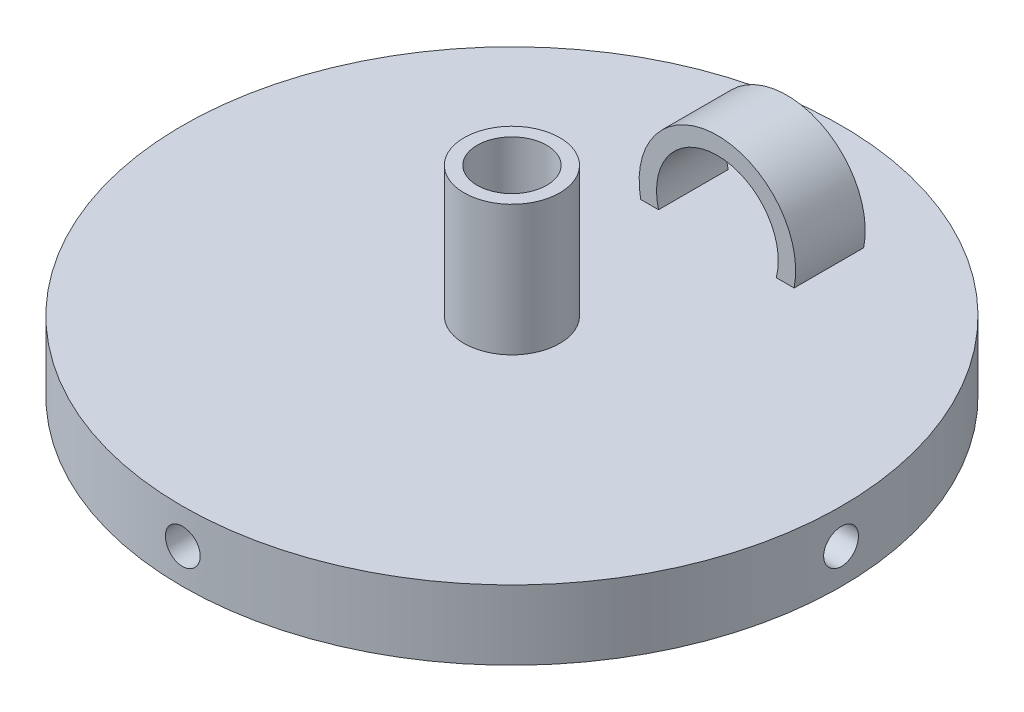
ISO-10303-21;
HEADER;
FILE_DESCRIPTION(('STEP AP214'),'2;1');
FILE_NAME('part.step','',(''),(''),'','','');
FILE_SCHEMA(('AUTOMOTIVE_DESIGN { 1 0 10303 214 1 1 1 1 }'));
ENDSEC;
DATA;
#1=APPLICATION_CONTEXT('core data for automotive mechanical design processes');
#2=APPLICATION_PROTOCOL_DEFINITION('international standard','automotive_design',2000,#1);
#3=PRODUCT_CONTEXT('',#1,'mechanical');
#4=PRODUCT('Part','Part','',(#3));
#5=PRODUCT_RELATED_PRODUCT_CATEGORY('part','',(#4));
#6=PRODUCT_DEFINITION_FORMATION('','',#4);
#7=PRODUCT_DEFINITION_CONTEXT('part definition',#1,'design');
#8=PRODUCT_DEFINITION('design','',#6,#7);
#9=PRODUCT_DEFINITION_SHAPE('','',#8);
#10=(LENGTH_UNIT() NAMED_UNIT(*) SI_UNIT(.MILLI.,.METRE.));
#11=(NAMED_UNIT(*) PLANE_ANGLE_UNIT() SI_UNIT($,.RADIAN.));
#12=(NAMED_UNIT(*) SI_UNIT($,.STERADIAN.) SOLID_ANGLE_UNIT());
#13=UNCERTAINTY_MEASURE_WITH_UNIT(LENGTH_MEASURE(1.E-05),#10,'distance_accuracy_value','');
#14=(GEOMETRIC_REPRESENTATION_CONTEXT(3) GLOBAL_UNCERTAINTY_ASSIGNED_CONTEXT((#13)) GLOBAL_UNIT_ASSIGNED_CONTEXT((#10,
#11,#12)) REPRESENTATION_CONTEXT('',''));
#15=CARTESIAN_POINT('',(0.,0.,0.));
#16=DIRECTION('',(0.,0.,1.));
#17=DIRECTION('',(1.,0.,0.));
#18=AXIS2_PLACEMENT_3D('',#15,#16,#17);
#19=CARTESIAN_POINT('',(0.,8.,-19.));
#20=DIRECTION('',(0.,1.,0.));
#21=DIRECTION('',(-1.,0.,0.));
#22=AXIS2_PLACEMENT_3D('',#19,#20,#21);
#23=PLANE('',#22);
#24=DIRECTION('',(1.,0.,0.));
#25=VECTOR('',#24,1.);
#26=CARTESIAN_POINT('',(0.,8.,-27.));
#27=LINE('',#26,#25);
#28=CARTESIAN_POINT('',(11.3945238196925,8.,-27.));
#29=VERTEX_POINT('',#28);
#30=CARTESIAN_POINT('',(13.4475922365198,8.,-27.));
#31=VERTEX_POINT('',#30);
#32=EDGE_CURVE('E134',#29,#31,#27,.T.);
#33=ORIENTED_EDGE('',*,*,#32,.T.);
#34=DIRECTION('',(0.,0.,-1.));
#35=VECTOR('',#34,1.);
#36=CARTESIAN_POINT('',(13.4475922365198,8.,-19.));
#37=LINE('',#36,#35);
#38=CARTESIAN_POINT('',(13.4475922365198,8.,-19.));
#39=VERTEX_POINT('',#38);
#40=EDGE_CURVE('E12',#39,#31,#37,.T.);
#41=ORIENTED_EDGE('',*,*,#40,.F.);
#42=DIRECTION('',(1.,0.,0.));
#43=VECTOR('',#42,1.);
#44=CARTESIAN_POINT('',(0.,8.,-19.));
#45=LINE('',#44,#43);
#46=CARTESIAN_POINT('',(11.3945238196925,8.,-19.));
#47=VERTEX_POINT('',#46);
#48=EDGE_CURVE('E109',#47,#39,#45,.T.);
#49=ORIENTED_EDGE('',*,*,#48,.F.);
#50=DIRECTION('',(0.,0.,-1.));
#51=VECTOR('',#50,1.);
#52=CARTESIAN_POINT('',(11.3945238196925,8.,-19.));
#53=LINE('',#52,#51);
#54=EDGE_CURVE('E76',#47,#29,#53,.T.);
#55=ORIENTED_EDGE('',*,*,#54,.T.);
#56=EDGE_LOOP('',(#33,#41,#49,#55));
#57=FACE_BOUND('',#56,.T.);
#58=ADVANCED_FACE('F58',(#57),#23,.F.);
#59=CARTESIAN_POINT('',(4.62784477283367,9.79222059936862,-19.));
#60=DIRECTION('',(0.,0.,-1.));
#61=DIRECTION('',(-1.,0.,0.));
#62=AXIS2_PLACEMENT_3D('',#59,#60,#61);
#63=CYLINDRICAL_SURFACE('',#62,9.);
#64=CARTESIAN_POINT('',(4.62784477283367,9.79222059936862,-27.));
#65=DIRECTION('',(0.,0.,1.));
#66=DIRECTION('',(1.,0.,0.));
#67=AXIS2_PLACEMENT_3D('',#64,#65,#66);
#68=CIRCLE('',#67,9.);
#69=CARTESIAN_POINT('',(-4.19190269085251,8.,-27.));
#70=VERTEX_POINT('',#69);
#71=EDGE_CURVE('E114',#31,#70,#68,.T.);
#72=ORIENTED_EDGE('',*,*,#71,.T.);
#73=DIRECTION('',(0.,0.,-1.));
#74=VECTOR('',#73,1.);
#75=CARTESIAN_POINT('',(-4.19190269085251,8.,-19.));
#76=LINE('',#75,#74);
#77=CARTESIAN_POINT('',(-4.19190269085251,8.,-19.));
#78=VERTEX_POINT('',#77);
#79=EDGE_CURVE('E68',#78,#70,#76,.T.);
#80=ORIENTED_EDGE('',*,*,#79,.F.);
#81=CARTESIAN_POINT('',(4.62784477283367,9.79222059936862,-19.));
#82=DIRECTION('',(0.,0.,1.));
#83=DIRECTION('',(1.,0.,0.));
#84=AXIS2_PLACEMENT_3D('',#81,#82,#83);
#85=CIRCLE('',#84,9.);
#86=EDGE_CURVE('E102',#39,#78,#85,.T.);
#87=ORIENTED_EDGE('',*,*,#86,.F.);
#88=ORIENTED_EDGE('',*,*,#40,.T.);
#89=EDGE_LOOP('',(#72,#80,#87,#88));
#90=FACE_BOUND('',#89,.T.);
#91=ADVANCED_FACE('F60',(#90),#63,.T.);
#92=CARTESIAN_POINT('',(-2.1388342740252,8.,-27.));
#93=VERTEX_POINT('',#92);
#94=EDGE_CURVE('E129',#70,#93,#27,.T.);
#95=ORIENTED_EDGE('',*,*,#94,.T.);
#96=DIRECTION('',(0.,0.,-1.));
#97=VECTOR('',#96,1.);
#98=CARTESIAN_POINT('',(-2.1388342740252,8.,-19.));
#99=LINE('',#98,#97);
#100=CARTESIAN_POINT('',(-2.1388342740252,8.,-19.));
#101=VERTEX_POINT('',#100);
#102=EDGE_CURVE('E91',#101,#93,#99,.T.);
#103=ORIENTED_EDGE('',*,*,#102,.F.);
#104=EDGE_CURVE('E108',#78,#101,#45,.T.);
#105=ORIENTED_EDGE('',*,*,#104,.F.);
#106=ORIENTED_EDGE('',*,*,#79,.T.);
#107=EDGE_LOOP('',(#95,#103,#105,#106));
#108=FACE_BOUND('',#107,.T.);
#109=ADVANCED_FACE('F118',(#108),#23,.F.);
#110=CARTESIAN_POINT('',(4.62784477283367,9.79222059936862,-19.));
#111=DIRECTION('',(0.,0.,-1.));
#112=DIRECTION('',(-1.,0.,0.));
#113=AXIS2_PLACEMENT_3D('',#110,#111,#112);
#114=CYLINDRICAL_SURFACE('',#113,7.);
#115=CARTESIAN_POINT('',(4.62784477283367,9.79222059936862,-27.));
#116=DIRECTION('',(0.,0.,1.));
#117=DIRECTION('',(1.,0.,0.));
#118=AXIS2_PLACEMENT_3D('',#115,#116,#117);
#119=CIRCLE('',#118,7.);
#120=EDGE_CURVE('E125',#29,#93,#119,.T.);
#121=ORIENTED_EDGE('',*,*,#120,.F.);
#122=ORIENTED_EDGE('',*,*,#54,.F.);
#123=CARTESIAN_POINT('',(4.62784477283367,9.79222059936862,-19.));
#124=DIRECTION('',(0.,0.,1.));
#125=DIRECTION('',(1.,0.,0.));
#126=AXIS2_PLACEMENT_3D('',#123,#124,#125);
#127=CIRCLE('',#126,7.);
#128=EDGE_CURVE('E120',#47,#101,#127,.T.);
#129=ORIENTED_EDGE('',*,*,#128,.T.);
#130=ORIENTED_EDGE('',*,*,#102,.T.);
#131=EDGE_LOOP('',(#121,#122,#129,#130));
#132=FACE_BOUND('',#131,.T.);
#133=ADVANCED_FACE('F142',(#132),#114,.F.);
#134=CARTESIAN_POINT('',(0.,0.,-19.));
#135=DIRECTION('',(0.,0.,1.));
#136=DIRECTION('',(1.,0.,0.));
#137=AXIS2_PLACEMENT_3D('',#134,#135,#136);
#138=PLANE('',#137);
#139=ORIENTED_EDGE('',*,*,#48,.T.);
#140=ORIENTED_EDGE('',*,*,#86,.T.);
#141=ORIENTED_EDGE('',*,*,#104,.T.);
#142=ORIENTED_EDGE('',*,*,#128,.F.);
#143=EDGE_LOOP('',(#139,#140,#141,#142));
#144=FACE_BOUND('',#143,.T.);
#145=ADVANCED_FACE('F105',(#144),#138,.T.);
#146=CARTESIAN_POINT('',(0.,0.,-27.));
#147=DIRECTION('',(0.,0.,1.));
#148=DIRECTION('',(1.,0.,0.));
#149=AXIS2_PLACEMENT_3D('',#146,#147,#148);
#150=PLANE('',#149);
#151=ORIENTED_EDGE('',*,*,#32,.F.);
#152=ORIENTED_EDGE('',*,*,#120,.T.);
#153=ORIENTED_EDGE('',*,*,#94,.F.);
#154=ORIENTED_EDGE('',*,*,#71,.F.);
#155=EDGE_LOOP('',(#151,#152,#153,#154));
#156=FACE_BOUND('',#155,.T.);
#157=ADVANCED_FACE('F141',(#156),#150,.F.);
#158=CLOSED_SHELL('',(#58,#91,#109,#133,#145,#157));
#159=MANIFOLD_SOLID_BREP('B2',#158);
#160=CARTESIAN_POINT('',(0.,8.,0.));
#161=DIRECTION('',(0.,1.,0.));
#162=DIRECTION('',(0.,0.,1.));
#163=AXIS2_PLACEMENT_3D('',#160,#161,#162);
#164=PLANE('',#163);
#165=CARTESIAN_POINT('',(0.,8.,0.));
#166=DIRECTION('',(0.,1.,0.));
#167=DIRECTION('',(0.,0.,1.));
#168=AXIS2_PLACEMENT_3D('',#165,#166,#167);
#169=CIRCLE('',#168,2.);
#170=CARTESIAN_POINT('',(0.,8.,2.));
#171=VERTEX_POINT('',#170);
#172=EDGE_CURVE('E304',#171,#171,#169,.T.);
#173=ORIENTED_EDGE('',*,*,#172,.F.);
#174=EDGE_LOOP('',(#173));
#175=FACE_BOUND('',#174,.T.);
#176=CARTESIAN_POINT('',(0.,8.,0.));
#177=DIRECTION('',(0.,1.,0.));
#178=DIRECTION('',(0.,0.,1.));
#179=AXIS2_PLACEMENT_3D('',#176,#177,#178);
#180=CIRCLE('',#179,4.);
#181=CARTESIAN_POINT('',(0.,8.,4.));
#182=VERTEX_POINT('',#181);
#183=EDGE_CURVE('E288',#182,#182,#180,.F.);
#184=ORIENTED_EDGE('',*,*,#183,.F.);
#185=EDGE_LOOP('',(#184));
#186=FACE_BOUND('',#185,.T.);
#187=ADVANCED_FACE('F220',(#175,#186),#164,.T.);
#188=CARTESIAN_POINT('',(0.,8.,0.));
#189=DIRECTION('',(0.,-1.,0.));
#190=DIRECTION('',(0.,0.,-1.));
#191=AXIS2_PLACEMENT_3D('',#188,#189,#190);
#192=CYLINDRICAL_SURFACE('',#191,37.9);
#193=CARTESIAN_POINT('',(-37.8471927624758,4.,2.));
#194=CARTESIAN_POINT('',(-37.8471934712636,3.8877430678654,1.99999504858307));
#195=CARTESIAN_POINT('',(-37.8476975718805,3.77540672996207,1.99051703891063));
#196=CARTESIAN_POINT('',(-37.8496598361114,3.55383361555922,1.95284212999765));
#197=CARTESIAN_POINT('',(-37.8511191210608,3.44460063969456,1.92462322938253));
#198=CARTESIAN_POINT('',(-37.8548259972506,3.23247598464724,1.85027726614055));
#199=CARTESIAN_POINT('',(-37.8570731836905,3.12958108100525,1.80415939817517));
#200=CARTESIAN_POINT('',(-37.8621021402955,2.93302073178272,1.69533888927265));
#201=CARTESIAN_POINT('',(-37.8648837849976,2.83935312790417,1.6326401393647));
#202=CARTESIAN_POINT('',(-37.8706717480776,2.66377444081299,1.49236035223487));
#203=CARTESIAN_POINT('',(-37.8736782828417,2.58187490780638,1.41476486617151));
#204=CARTESIAN_POINT('',(-37.8795752163352,2.43225575483482,1.24692337632827));
#205=CARTESIAN_POINT('',(-37.8824656102995,2.36453671621702,1.15667685415641));
#206=CARTESIAN_POINT('',(-37.8878062680956,2.24516823135971,0.96603355032804));
#207=CARTESIAN_POINT('',(-37.8902562818845,2.19352790232265,0.865631052461651));
#208=CARTESIAN_POINT('',(-37.8944378887471,2.10784119780192,0.657566067575661));
#209=CARTESIAN_POINT('',(-37.8961694877134,2.07379467800932,0.549903640112047));
#210=CARTESIAN_POINT('',(-37.8987176791808,2.02429288952578,0.330482286965941));
#211=CARTESIAN_POINT('',(-37.899535130793,2.00882016427008,0.218727309645029));
#212=CARTESIAN_POINT('',(-37.9001657951664,1.99685129831468,-0.00579648709187268));
#213=CARTESIAN_POINT('',(-37.8999790165226,2.00035499519731,-0.118565297822298));
#214=CARTESIAN_POINT('',(-37.8986229899586,2.02622504909496,-0.34179745889771));
#215=CARTESIAN_POINT('',(-37.89745472056,2.04857261932126,-0.452262993183088));
#216=CARTESIAN_POINT('',(-37.8942684179092,2.11146692557115,-0.667872580402175));
#217=CARTESIAN_POINT('',(-37.8922503807963,2.15201374427792,-0.773016609156697));
#218=CARTESIAN_POINT('',(-37.88759015558,2.25017696293296,-0.975058988743318));
#219=CARTESIAN_POINT('',(-37.8849476549647,2.30780191329181,-1.07195317781942));
#220=CARTESIAN_POINT('',(-37.8793360500192,2.43847939529047,-1.25469992849497));
#221=CARTESIAN_POINT('',(-37.8763669431053,2.51153204897808,-1.34055240273531));
#222=CARTESIAN_POINT('',(-37.8704321754108,2.67109742640786,-1.49888827202154));
#223=CARTESIAN_POINT('',(-37.8674665232441,2.75762645077089,-1.57135524120749));
#224=CARTESIAN_POINT('',(-37.8618766394378,2.9416310954343,-1.70073646919829));
#225=CARTESIAN_POINT('',(-37.859252407897,3.03910671890029,-1.75765072350547));
#226=CARTESIAN_POINT('',(-37.854641580931,3.24224760772415,-1.85430955443145));
#227=CARTESIAN_POINT('',(-37.8526550090026,3.34791317469013,-1.89405349837072));
#228=CARTESIAN_POINT('',(-37.8495444140631,3.56442995336271,-1.95523247813325));
#229=CARTESIAN_POINT('',(-37.8484203838258,3.67528112161646,-1.9766676673461));
#230=CARTESIAN_POINT('',(-37.8471629701894,3.89887931909088,-2.00060032563233));
#231=CARTESIAN_POINT('',(-37.8470283938279,4.01162390094634,-2.00312060007115));
#232=CARTESIAN_POINT('',(-37.8477619493591,4.23593433199948,-1.98921141534305));
#233=CARTESIAN_POINT('',(-37.8486300775515,4.34750018554549,-1.97278202610623));
#234=CARTESIAN_POINT('',(-37.8512701097101,4.56622206823,-1.92145880450497));
#235=CARTESIAN_POINT('',(-37.853041502091,4.67338055649921,-1.88657542357919));
#236=CARTESIAN_POINT('',(-37.8572879819564,4.88032165657943,-1.79934500869784));
#237=CARTESIAN_POINT('',(-37.8597630739827,4.98010422078044,-1.74699786202945));
#238=CARTESIAN_POINT('',(-37.8651408981252,5.1695658980323,-1.62626737981789));
#239=CARTESIAN_POINT('',(-37.8680440375595,5.25923524258385,-1.5578687330285));
#240=CARTESIAN_POINT('',(-37.873949322893,5.42582680604501,-1.40699918899017));
#241=CARTESIAN_POINT('',(-37.8769514694931,5.50274893470123,-1.32452819211396));
#242=CARTESIAN_POINT('',(-37.8827198991278,5.64173924547547,-1.14775700516708));
#243=CARTESIAN_POINT('',(-37.8854859464333,5.70379269137299,-1.05344521968124));
#244=CARTESIAN_POINT('',(-37.8904670794229,5.8111834070306,-0.855728168896378));
#245=CARTESIAN_POINT('',(-37.8926821677086,5.85652075572791,-0.752322946541489));
#246=CARTESIAN_POINT('',(-37.8963106252973,5.92916657538631,-0.539409004979136));
#247=CARTESIAN_POINT('',(-37.8977244128534,5.95648445315131,-0.429903502765619));
#248=CARTESIAN_POINT('',(-37.8995926063059,5.99234667800025,-0.207852483212604));
#249=CARTESIAN_POINT('',(-37.9000470184301,6.00089114694758,-0.0953069856113588));
#250=CARTESIAN_POINT('',(-37.8999452771534,5.99896285183993,0.129483099008301));
#251=CARTESIAN_POINT('',(-37.8993903514761,5.98851319159503,0.241727885505699));
#252=CARTESIAN_POINT('',(-37.8973348148902,5.94894105513696,0.462867072532208));
#253=CARTESIAN_POINT('',(-37.8958342022213,5.91981854416799,0.571761466824831));
#254=CARTESIAN_POINT('',(-37.8920560866739,5.84373223156533,0.783113272211763));
#255=CARTESIAN_POINT('',(-37.8897785799969,5.79676834270213,0.885570651831561));
#256=CARTESIAN_POINT('',(-37.8847027263186,5.68633619711729,1.08114812946445));
#257=CARTESIAN_POINT('',(-37.8819043948027,5.62286843107327,1.17426850496246));
#258=CARTESIAN_POINT('',(-37.876097887832,5.48114668336993,1.34864453080645));
#259=CARTESIAN_POINT('',(-37.8730894837987,5.40287643195989,1.42988694994145));
#260=CARTESIAN_POINT('',(-37.8672035262079,5.23378532718397,1.57810486647913));
#261=CARTESIAN_POINT('',(-37.8643260049911,5.14296139400181,1.64507685261309));
#262=CARTESIAN_POINT('',(-37.8590242665282,4.95126312596171,1.76288788959718));
#263=CARTESIAN_POINT('',(-37.8566005129052,4.85037867158495,1.81371047684881));
#264=CARTESIAN_POINT('',(-37.8524868808294,4.64157105207396,1.89763511093848));
#265=CARTESIAN_POINT('',(-37.8507961374595,4.53365635626696,1.93075805330479));
#266=CARTESIAN_POINT('',(-37.8487860888568,4.35422768933679,1.96967092172787));
#267=CARTESIAN_POINT('',(-37.8481912336096,4.283875452704,1.9810297678307));
#268=CARTESIAN_POINT('',(-37.8473943458439,4.14235945681894,1.99619587348059));
#269=CARTESIAN_POINT('',(-37.8471923129477,4.07119569834743,2.00000314029236));
#270=CARTESIAN_POINT('',(-37.8471927624758,4.,2.));
#271=B_SPLINE_CURVE_WITH_KNOTS('',3,(#193,#194,#195,#196,#197,#198,#199,#200,#201,#202,#203,
#204,#205,#206,#207,#208,#209,#210,#211,#212,#213,#214,#215,#216,#217,#218,#219,#220,#221,#222,
#223,#224,#225,#226,#227,#228,#229,#230,#231,#232,#233,#234,#235,#236,#237,#238,#239,#240,#241,
#242,#243,#244,#245,#246,#247,#248,#249,#250,#251,#252,#253,#254,#255,#256,#257,#258,#259,#260,
#261,#262,#263,#264,#265,#266,#267,#268,#269,#270),.UNSPECIFIED.,.T.,.F.,(4,2,2,2,2,2,2,2,2,2,2,
2,2,2,2,2,2,2,2,2,2,2,2,2,2,2,2,2,2,2,2,2,2,2,2,2,2,2,4),(0.,0.336510901288289,
0.673417558624167,1.01015137630769,1.34680624280934,1.68378930707747,2.02078618368542,
2.3579738030085,2.69515865658861,3.03202635853839,3.36889117726944,3.70542054820233,
4.04195144807781,4.37865112241302,4.71535346046262,5.05246627285674,5.38957918274025,
5.72670451326413,6.06382701934541,6.40054299761357,6.73725773329987,7.07378197405735,
7.41030838681695,7.74715712049443,8.08400823904104,8.4211918395216,8.75837384772412,
9.09537969534133,9.43238335535394,9.76897736990281,10.1055720109566,10.4421682976999,
10.7787545782258,11.115712981434,11.4527541984399,11.7901379198424,12.1271224539141,
12.3405449233445,12.5539671874592),.UNSPECIFIED.);
#272=CARTESIAN_POINT('',(-37.8471927624758,4.,2.));
#273=VERTEX_POINT('',#272);
#274=EDGE_CURVE('E57',#273,#273,#271,.T.);
#275=ORIENTED_EDGE('',*,*,#274,.T.);
#276=EDGE_LOOP('',(#275));
#277=FACE_BOUND('',#276,.T.);
#278=CARTESIAN_POINT('',(2.,4.,37.8471927624758));
#279=CARTESIAN_POINT('',(1.99999504858307,3.8877430678654,37.8471934712636));
#280=CARTESIAN_POINT('',(1.99051703891063,3.77540672996207,37.8476975718805));
#281=CARTESIAN_POINT('',(1.95284212999765,3.55383361555922,37.8496598361114));
#282=CARTESIAN_POINT('',(1.92462322938253,3.44460063969456,37.8511191210608));
#283=CARTESIAN_POINT('',(1.85027726614055,3.23247598464724,37.8548259972506));
#284=CARTESIAN_POINT('',(1.80415939817517,3.12958108100525,37.8570731836905));
#285=CARTESIAN_POINT('',(1.69533888927265,2.93302073178272,37.8621021402955));
#286=CARTESIAN_POINT('',(1.6326401393647,2.83935312790417,37.8648837849976));
#287=CARTESIAN_POINT('',(1.49236035223487,2.66377444081299,37.8706717480776));
#288=CARTESIAN_POINT('',(1.41476486617151,2.58187490780638,37.8736782828417));
#289=CARTESIAN_POINT('',(1.24692337632827,2.43225575483482,37.8795752163352));
#290=CARTESIAN_POINT('',(1.15667685415641,2.36453671621702,37.8824656102995));
#291=CARTESIAN_POINT('',(0.96603355032804,2.24516823135971,37.8878062680956));
#292=CARTESIAN_POINT('',(0.865631052461651,2.19352790232265,37.8902562818845));
#293=CARTESIAN_POINT('',(0.657566067575661,2.10784119780191,37.8944378887471));
#294=CARTESIAN_POINT('',(0.549903640112047,2.07379467800932,37.8961694877134));
#295=CARTESIAN_POINT('',(0.330482286965941,2.02429288952577,37.8987176791808));
#296=CARTESIAN_POINT('',(0.218727309645029,2.00882016427008,37.899535130793));
#297=CARTESIAN_POINT('',(-0.00579648709187262,1.99685129831468,37.9001657951664));
#298=CARTESIAN_POINT('',(-0.118565297822298,2.00035499519731,37.8999790165226));
#299=CARTESIAN_POINT('',(-0.34179745889771,2.02622504909495,37.8986229899586));
#300=CARTESIAN_POINT('',(-0.452262993183088,2.04857261932126,37.89745472056));
#301=CARTESIAN_POINT('',(-0.667872580402176,2.11146692557114,37.8942684179092));
#302=CARTESIAN_POINT('',(-0.773016609156697,2.15201374427792,37.8922503807963));
#303=CARTESIAN_POINT('',(-0.975058988743318,2.25017696293296,37.88759015558));
#304=CARTESIAN_POINT('',(-1.07195317781942,2.30780191329181,37.8849476549647));
#305=CARTESIAN_POINT('',(-1.25469992849497,2.43847939529047,37.8793360500192));
#306=CARTESIAN_POINT('',(-1.34055240273531,2.51153204897808,37.8763669431053));
#307=CARTESIAN_POINT('',(-1.49888827202154,2.67109742640785,37.8704321754108));
#308=CARTESIAN_POINT('',(-1.57135524120749,2.75762645077089,37.8674665232441));
#309=CARTESIAN_POINT('',(-1.70073646919829,2.94163109543429,37.8618766394378));
#310=CARTESIAN_POINT('',(-1.75765072350547,3.03910671890029,37.859252407897));
#311=CARTESIAN_POINT('',(-1.85430955443145,3.24224760772415,37.854641580931));
#312=CARTESIAN_POINT('',(-1.89405349837072,3.34791317469013,37.8526550090026));
#313=CARTESIAN_POINT('',(-1.95523247813325,3.56442995336271,37.8495444140631));
#314=CARTESIAN_POINT('',(-1.9766676673461,3.67528112161645,37.8484203838258));
#315=CARTESIAN_POINT('',(-2.00060032563233,3.89887931909087,37.8471629701894));
#316=CARTESIAN_POINT('',(-2.00312060007115,4.01162390094634,37.8470283938279));
#317=CARTESIAN_POINT('',(-1.98921141534305,4.23593433199948,37.8477619493591));
#318=CARTESIAN_POINT('',(-1.97278202610623,4.34750018554549,37.8486300775515));
#319=CARTESIAN_POINT('',(-1.92145880450497,4.56622206823,37.8512701097101));
#320=CARTESIAN_POINT('',(-1.88657542357919,4.67338055649921,37.853041502091));
#321=CARTESIAN_POINT('',(-1.79934500869784,4.88032165657943,37.8572879819564));
#322=CARTESIAN_POINT('',(-1.74699786202945,4.98010422078043,37.8597630739827));
#323=CARTESIAN_POINT('',(-1.62626737981789,5.1695658980323,37.8651408981252));
#324=CARTESIAN_POINT('',(-1.5578687330285,5.25923524258385,37.8680440375595));
#325=CARTESIAN_POINT('',(-1.40699918899017,5.42582680604501,37.873949322893));
#326=CARTESIAN_POINT('',(-1.32452819211396,5.50274893470123,37.8769514694931));
#327=CARTESIAN_POINT('',(-1.14775700516708,5.64173924547547,37.8827198991278));
#328=CARTESIAN_POINT('',(-1.05344521968124,5.70379269137299,37.8854859464333));
#329=CARTESIAN_POINT('',(-0.855728168896377,5.8111834070306,37.8904670794229));
#330=CARTESIAN_POINT('',(-0.752322946541489,5.85652075572791,37.8926821677086));
#331=CARTESIAN_POINT('',(-0.539409004979136,5.92916657538631,37.8963106252973));
#332=CARTESIAN_POINT('',(-0.42990350276562,5.95648445315131,37.8977244128534));
#333=CARTESIAN_POINT('',(-0.207852483212605,5.99234667800025,37.8995926063059));
#334=CARTESIAN_POINT('',(-0.0953069856113589,6.00089114694758,37.9000470184301));
#335=CARTESIAN_POINT('',(0.129483099008302,5.99896285183993,37.8999452771534));
#336=CARTESIAN_POINT('',(0.2417278855057,5.98851319159503,37.8993903514761));
#337=CARTESIAN_POINT('',(0.462867072532209,5.94894105513696,37.8973348148902));
#338=CARTESIAN_POINT('',(0.571761466824832,5.91981854416798,37.8958342022213));
#339=CARTESIAN_POINT('',(0.783113272211764,5.84373223156533,37.8920560866739));
#340=CARTESIAN_POINT('',(0.885570651831563,5.79676834270212,37.8897785799969));
#341=CARTESIAN_POINT('',(1.08114812946445,5.68633619711728,37.8847027263186));
#342=CARTESIAN_POINT('',(1.17426850496246,5.62286843107326,37.8819043948027));
#343=CARTESIAN_POINT('',(1.34864453080645,5.48114668336993,37.876097887832));
#344=CARTESIAN_POINT('',(1.42988694994145,5.40287643195989,37.8730894837987));
#345=CARTESIAN_POINT('',(1.57810486647913,5.23378532718397,37.8672035262079));
#346=CARTESIAN_POINT('',(1.64507685261309,5.14296139400181,37.8643260049911));
#347=CARTESIAN_POINT('',(1.76288788959718,4.95126312596171,37.8590242665282));
#348=CARTESIAN_POINT('',(1.81371047684881,4.85037867158495,37.8566005129052));
#349=CARTESIAN_POINT('',(1.89763511093848,4.64157105207395,37.8524868808294));
#350=CARTESIAN_POINT('',(1.93075805330479,4.53365635626696,37.8507961374595));
#351=CARTESIAN_POINT('',(1.96967092172787,4.35422768933679,37.8487860888568));
#352=CARTESIAN_POINT('',(1.9810297678307,4.283875452704,37.8481912336096));
#353=CARTESIAN_POINT('',(1.99619587348059,4.14235945681894,37.8473943458439));
#354=CARTESIAN_POINT('',(2.00000314029236,4.07119569834743,37.8471923129477));
#355=CARTESIAN_POINT('',(2.,4.,37.8471927624758));
#356=B_SPLINE_CURVE_WITH_KNOTS('',3,(#278,#279,#280,#281,#282,#283,#284,#285,#286,#287,#288,
#289,#290,#291,#292,#293,#294,#295,#296,#297,#298,#299,#300,#301,#302,#303,#304,#305,#306,#307,
#308,#309,#310,#311,#312,#313,#314,#315,#316,#317,#318,#319,#320,#321,#322,#323,#324,#325,#326,
#327,#328,#329,#330,#331,#332,#333,#334,#335,#336,#337,#338,#339,#340,#341,#342,#343,#344,#345,
#346,#347,#348,#349,#350,#351,#352,#353,#354,#355),.UNSPECIFIED.,.T.,.F.,(4,2,2,2,2,2,2,2,2,2,2,
2,2,2,2,2,2,2,2,2,2,2,2,2,2,2,2,2,2,2,2,2,2,2,2,2,2,2,4),(0.,0.336510901288289,
0.673417558624167,1.01015137630769,1.34680624280934,1.68378930707747,2.02078618368542,
2.3579738030085,2.69515865658861,3.03202635853839,3.36889117726944,3.70542054820233,
4.04195144807781,4.37865112241302,4.71535346046262,5.05246627285674,5.38957918274025,
5.72670451326414,6.06382701934541,6.40054299761357,6.73725773329987,7.07378197405735,
7.41030838681695,7.74715712049443,8.08400823904104,8.4211918395216,8.75837384772412,
9.09537969534133,9.43238335535394,9.76897736990282,10.1055720109566,10.4421682976999,
10.7787545782258,11.115712981434,11.4527541984399,11.7901379198424,12.1271224539141,
12.3405449233445,12.5539671874592),.UNSPECIFIED.);
#357=CARTESIAN_POINT('',(2.,4.,37.8471927624758));
#358=VERTEX_POINT('',#357);
#359=EDGE_CURVE('E233',#358,#358,#356,.T.);
#360=ORIENTED_EDGE('',*,*,#359,.T.);
#361=EDGE_LOOP('',(#360));
#362=FACE_BOUND('',#361,.T.);
#363=CARTESIAN_POINT('',(37.8471927624758,4.,-2.));
#364=CARTESIAN_POINT('',(37.8471934712636,3.8877430678654,-1.99999504858307));
#365=CARTESIAN_POINT('',(37.8476975718805,3.77540672996207,-1.99051703891063));
#366=CARTESIAN_POINT('',(37.8496598361114,3.55383361555922,-1.95284212999765));
#367=CARTESIAN_POINT('',(37.8511191210608,3.44460063969456,-1.92462322938253));
#368=CARTESIAN_POINT('',(37.8548259972506,3.23247598464724,-1.85027726614055));
#369=CARTESIAN_POINT('',(37.8570731836905,3.12958108100525,-1.80415939817517));
#370=CARTESIAN_POINT('',(37.8621021402955,2.93302073178272,-1.69533888927265));
#371=CARTESIAN_POINT('',(37.8648837849976,2.83935312790417,-1.6326401393647));
#372=CARTESIAN_POINT('',(37.8706717480776,2.66377444081299,-1.49236035223487));
#373=CARTESIAN_POINT('',(37.8736782828417,2.58187490780638,-1.41476486617151));
#374=CARTESIAN_POINT('',(37.8795752163352,2.43225575483482,-1.24692337632827));
#375=CARTESIAN_POINT('',(37.8824656102995,2.36453671621702,-1.15667685415641));
#376=CARTESIAN_POINT('',(37.8878062680956,2.24516823135971,-0.96603355032804));
#377=CARTESIAN_POINT('',(37.8902562818845,2.19352790232265,-0.865631052461651));
#378=CARTESIAN_POINT('',(37.8944378887471,2.10784119780192,-0.657566067575661));
#379=CARTESIAN_POINT('',(37.8961694877134,2.07379467800932,-0.549903640112047));
#380=CARTESIAN_POINT('',(37.8987176791808,2.02429288952578,-0.330482286965941));
#381=CARTESIAN_POINT('',(37.899535130793,2.00882016427008,-0.218727309645029));
#382=CARTESIAN_POINT('',(37.9001657951664,1.99685129831468,0.00579648709187268));
#383=CARTESIAN_POINT('',(37.8999790165226,2.00035499519731,0.118565297822298));
#384=CARTESIAN_POINT('',(37.8986229899586,2.02622504909496,0.34179745889771));
#385=CARTESIAN_POINT('',(37.89745472056,2.04857261932126,0.452262993183088));
#386=CARTESIAN_POINT('',(37.8942684179092,2.11146692557115,0.667872580402175));
#387=CARTESIAN_POINT('',(37.8922503807963,2.15201374427792,0.773016609156697));
#388=CARTESIAN_POINT('',(37.88759015558,2.25017696293296,0.975058988743318));
#389=CARTESIAN_POINT('',(37.8849476549647,2.30780191329181,1.07195317781942));
#390=CARTESIAN_POINT('',(37.8793360500192,2.43847939529047,1.25469992849497));
#391=CARTESIAN_POINT('',(37.8763669431053,2.51153204897808,1.34055240273531));
#392=CARTESIAN_POINT('',(37.8704321754108,2.67109742640786,1.49888827202154));
#393=CARTESIAN_POINT('',(37.8674665232441,2.75762645077089,1.57135524120749));
#394=CARTESIAN_POINT('',(37.8618766394378,2.9416310954343,1.70073646919829));
#395=CARTESIAN_POINT('',(37.859252407897,3.03910671890029,1.75765072350547));
#396=CARTESIAN_POINT('',(37.854641580931,3.24224760772415,1.85430955443145));
#397=CARTESIAN_POINT('',(37.8526550090026,3.34791317469013,1.89405349837072));
#398=CARTESIAN_POINT('',(37.8495444140631,3.56442995336271,1.95523247813325));
#399=CARTESIAN_POINT('',(37.8484203838258,3.67528112161646,1.9766676673461));
#400=CARTESIAN_POINT('',(37.8471629701894,3.89887931909088,2.00060032563233));
#401=CARTESIAN_POINT('',(37.8470283938279,4.01162390094634,2.00312060007115));
#402=CARTESIAN_POINT('',(37.8477619493591,4.23593433199948,1.98921141534305));
#403=CARTESIAN_POINT('',(37.8486300775515,4.34750018554549,1.97278202610623));
#404=CARTESIAN_POINT('',(37.8512701097101,4.56622206823,1.92145880450497));
#405=CARTESIAN_POINT('',(37.853041502091,4.67338055649921,1.88657542357919));
#406=CARTESIAN_POINT('',(37.8572879819564,4.88032165657943,1.79934500869784));
#407=CARTESIAN_POINT('',(37.8597630739827,4.98010422078044,1.74699786202945));
#408=CARTESIAN_POINT('',(37.8651408981252,5.1695658980323,1.62626737981789));
#409=CARTESIAN_POINT('',(37.8680440375595,5.25923524258385,1.5578687330285));
#410=CARTESIAN_POINT('',(37.873949322893,5.42582680604501,1.40699918899017));
#411=CARTESIAN_POINT('',(37.8769514694931,5.50274893470123,1.32452819211396));
#412=CARTESIAN_POINT('',(37.8827198991278,5.64173924547547,1.14775700516708));
#413=CARTESIAN_POINT('',(37.8854859464333,5.70379269137299,1.05344521968124));
#414=CARTESIAN_POINT('',(37.8904670794229,5.8111834070306,0.855728168896378));
#415=CARTESIAN_POINT('',(37.8926821677086,5.85652075572791,0.752322946541489));
#416=CARTESIAN_POINT('',(37.8963106252973,5.92916657538631,0.539409004979136));
#417=CARTESIAN_POINT('',(37.8977244128534,5.95648445315131,0.429903502765619));
#418=CARTESIAN_POINT('',(37.8995926063059,5.99234667800025,0.207852483212604));
#419=CARTESIAN_POINT('',(37.9000470184301,6.00089114694758,0.0953069856113588));
#420=CARTESIAN_POINT('',(37.8999452771534,5.99896285183993,-0.129483099008301));
#421=CARTESIAN_POINT('',(37.8993903514761,5.98851319159503,-0.241727885505699));
#422=CARTESIAN_POINT('',(37.8973348148902,5.94894105513696,-0.462867072532208));
#423=CARTESIAN_POINT('',(37.8958342022213,5.91981854416799,-0.571761466824831));
#424=CARTESIAN_POINT('',(37.8920560866739,5.84373223156533,-0.783113272211763));
#425=CARTESIAN_POINT('',(37.8897785799969,5.79676834270213,-0.885570651831561));
#426=CARTESIAN_POINT('',(37.8847027263186,5.68633619711729,-1.08114812946445));
#427=CARTESIAN_POINT('',(37.8819043948027,5.62286843107327,-1.17426850496246));
#428=CARTESIAN_POINT('',(37.876097887832,5.48114668336993,-1.34864453080645));
#429=CARTESIAN_POINT('',(37.8730894837987,5.40287643195989,-1.42988694994145));
#430=CARTESIAN_POINT('',(37.8672035262079,5.23378532718397,-1.57810486647913));
#431=CARTESIAN_POINT('',(37.8643260049911,5.14296139400181,-1.64507685261309));
#432=CARTESIAN_POINT('',(37.8590242665282,4.95126312596171,-1.76288788959718));
#433=CARTESIAN_POINT('',(37.8566005129052,4.85037867158495,-1.81371047684881));
#434=CARTESIAN_POINT('',(37.8524868808294,4.64157105207396,-1.89763511093848));
#435=CARTESIAN_POINT('',(37.8507961374595,4.53365635626696,-1.93075805330479));
#436=CARTESIAN_POINT('',(37.8487860888568,4.35422768933679,-1.96967092172787));
#437=CARTESIAN_POINT('',(37.8481912336096,4.283875452704,-1.9810297678307));
#438=CARTESIAN_POINT('',(37.8473943458439,4.14235945681894,-1.99619587348059));
#439=CARTESIAN_POINT('',(37.8471923129477,4.07119569834743,-2.00000314029236));
#440=CARTESIAN_POINT('',(37.8471927624758,4.,-2.));
#441=B_SPLINE_CURVE_WITH_KNOTS('',3,(#363,#364,#365,#366,#367,#368,#369,#370,#371,#372,#373,
#374,#375,#376,#377,#378,#379,#380,#381,#382,#383,#384,#385,#386,#387,#388,#389,#390,#391,#392,
#393,#394,#395,#396,#397,#398,#399,#400,#401,#402,#403,#404,#405,#406,#407,#408,#409,#410,#411,
#412,#413,#414,#415,#416,#417,#418,#419,#420,#421,#422,#423,#424,#425,#426,#427,#428,#429,#430,
#431,#432,#433,#434,#435,#436,#437,#438,#439,#440),.UNSPECIFIED.,.T.,.F.,(4,2,2,2,2,2,2,2,2,2,2,
2,2,2,2,2,2,2,2,2,2,2,2,2,2,2,2,2,2,2,2,2,2,2,2,2,2,2,4),(0.,0.336510901288289,
0.673417558624167,1.01015137630769,1.34680624280934,1.68378930707747,2.02078618368542,
2.3579738030085,2.69515865658861,3.03202635853839,3.36889117726944,3.70542054820233,
4.04195144807781,4.37865112241302,4.71535346046262,5.05246627285674,5.38957918274025,
5.72670451326413,6.06382701934541,6.40054299761357,6.73725773329987,7.07378197405735,
7.41030838681695,7.74715712049443,8.08400823904104,8.4211918395216,8.75837384772412,
9.09537969534133,9.43238335535394,9.76897736990281,10.1055720109566,10.4421682976999,
10.7787545782258,11.115712981434,11.4527541984399,11.7901379198424,12.1271224539141,
12.3405449233445,12.5539671874592),.UNSPECIFIED.);
#442=CARTESIAN_POINT('',(37.8471927624758,4.,-2.));
#443=VERTEX_POINT('',#442);
#444=EDGE_CURVE('E239',#443,#443,#441,.T.);
#445=ORIENTED_EDGE('',*,*,#444,.T.);
#446=EDGE_LOOP('',(#445));
#447=FACE_BOUND('',#446,.T.);
#448=CARTESIAN_POINT('',(0.,6.,-37.9));
#449=CARTESIAN_POINT('',(-0.112257054855992,5.9999950486945,-37.8999992948922));
#450=CARTESIAN_POINT('',(-0.224593515063789,5.99051701900019,-37.8994959140965));
#451=CARTESIAN_POINT('',(-0.446166883597219,5.9528420233233,-37.897536221552));
#452=CARTESIAN_POINT('',(-0.555399991383726,5.9246230563821,-37.8960787898221));
#453=CARTESIAN_POINT('',(-0.76752492529281,5.85027689908638,-37.8923759355917));
#454=CARTESIAN_POINT('',(-0.870419974757236,5.80415890022933,-37.8901309175886));
#455=CARTESIAN_POINT('',(-1.06698056796412,5.69533808315639,-37.8851056648911));
#456=CARTESIAN_POINT('',(-1.16064827018929,5.63263915629445,-37.882325555818));
#457=CARTESIAN_POINT('',(-1.33622684480633,5.49235919100966,-37.8765393689844));
#458=CARTESIAN_POINT('',(-1.41812619848245,5.41476374321993,-37.8735330741612));
#459=CARTESIAN_POINT('',(-1.56774500575072,5.24692240502753,-37.8676352107826));
#460=CARTESIAN_POINT('',(-1.63546387744638,5.15667599574588,-37.8647436469391));
#461=CARTESIAN_POINT('',(-1.75483218886153,4.96603278941428,-37.8593997460341));
#462=CARTESIAN_POINT('',(-1.80647248041217,4.86563025675437,-37.8569476593557));
#463=CARTESIAN_POINT('',(-1.89215910600895,4.65756519621002,-37.8527619187598));
#464=CARTESIAN_POINT('',(-1.92620558481798,4.54990272806898,-37.851028258931));
#465=CARTESIAN_POINT('',(-1.97570728601775,4.33048125612484,-37.8484768645277));
#466=CARTESIAN_POINT('',(-1.99117996195101,4.21872620001615,-37.8476582701288));
#467=CARTESIAN_POINT('',(-2.0031487019693,3.9942022494395,-37.8470267384348));
#468=CARTESIAN_POINT('',(-1.99964492899325,3.88143336368496,-37.8472137925048));
#469=CARTESIAN_POINT('',(-1.97377475582394,3.65820154141972,-37.8485716649166));
#470=CARTESIAN_POINT('',(-1.95142721898407,3.54773641203489,-37.849741499452));
#471=CARTESIAN_POINT('',(-1.88853312032835,3.33212761742,-37.8529315353253));
#472=CARTESIAN_POINT('',(-1.84798647508482,3.22698397658697,-37.8549517405615));
#473=CARTESIAN_POINT('',(-1.74982361310471,3.02494206256189,-37.8596159631357));
#474=CARTESIAN_POINT('',(-1.6921988050739,2.92804797102221,-37.8622602943082));
#475=CARTESIAN_POINT('',(-1.56152162551749,2.74530135482071,-37.867874416859));
#476=CARTESIAN_POINT('',(-1.48846913203212,2.65944891745459,-37.8708442108102));
#477=CARTESIAN_POINT('',(-1.32890386676344,2.50111286272853,-37.8767789159769));
#478=CARTESIAN_POINT('',(-1.24237476203208,2.42864570370123,-37.8797438167968));
#479=CARTESIAN_POINT('',(-1.05836988946896,2.29926413119185,-37.8853310795876));
#480=CARTESIAN_POINT('',(-0.960894118740026,2.24234972182604,-37.8879534414677));
#481=CARTESIAN_POINT('',(-0.757753193177851,2.14569077989017,-37.8925602240943));
#482=CARTESIAN_POINT('',(-0.652087759823309,2.10594683157082,-37.8945446231326));
#483=CARTESIAN_POINT('',(-0.435571271095299,2.04476780196631,-37.897651530786));
#484=CARTESIAN_POINT('',(-0.324720258950277,2.02333256808322,-37.8987740465846));
#485=CARTESIAN_POINT('',(-0.101122129054202,1.99939974181352,-37.9000297585278));
#486=CARTESIAN_POINT('',(0.0116225458890271,1.99687938651852,-37.9001641438233));
#487=CARTESIAN_POINT('',(0.235933182653,2.01078844277392,-37.8994316081418));
#488=CARTESIAN_POINT('',(0.34749914882247,2.02721778438672,-37.8985646908603));
#489=CARTESIAN_POINT('',(0.566221566236266,2.07854102397124,-37.8959279484516));
#490=CARTESIAN_POINT('',(0.673380465353218,2.11342451826193,-37.8941586320796));
#491=CARTESIAN_POINT('',(0.880322336835924,2.20065529778504,-37.8899162623562));
#492=CARTESIAN_POINT('',(0.980105261871691,2.25300269506756,-37.8874432044894));
#493=CARTESIAN_POINT('',(1.16956717718843,2.37373354171707,-37.8820685297106));
#494=CARTESIAN_POINT('',(1.2592364396127,2.44213223856746,-37.8791665062908));
#495=CARTESIAN_POINT('',(1.42582781398511,2.59300183629301,-37.8732620353903));
#496=CARTESIAN_POINT('',(1.50274983532923,2.67547283718192,-37.8702595871959));
#497=CARTESIAN_POINT('',(1.64173992529462,2.85224397570175,-37.8644892681303));
#498=CARTESIAN_POINT('',(1.70379325813346,2.94655570834686,-37.8617216317117));
#499=CARTESIAN_POINT('',(1.81118377518819,3.1442726243527,-37.85673672865));
#500=CARTESIAN_POINT('',(1.85652103833458,3.24767776477301,-37.8545194594081));
#501=CARTESIAN_POINT('',(1.92916679891896,3.46059176706347,-37.850887002676));
#502=CARTESIAN_POINT('',(1.95648466615832,3.57009742458437,-37.849471398387));
#503=CARTESIAN_POINT('',(1.99234681729141,3.7921487707865,-37.8476007374349));
#504=CARTESIAN_POINT('',(2.0008912238709,3.90469443959619,-37.8471456744947));
#505=CARTESIAN_POINT('',(1.99896275156646,4.12948440824208,-37.8472475668565));
#506=CARTESIAN_POINT('',(1.9885130507739,4.24172890822093,-37.8478032887206));
#507=CARTESIAN_POINT('',(1.94894093423872,4.4628675123692,-37.8498615110144));
#508=CARTESIAN_POINT('',(1.91981848322667,4.57176161020992,-37.8513640132322));
#509=CARTESIAN_POINT('',(1.84373239712493,4.78311283821951,-37.8551461742735));
#510=CARTESIAN_POINT('',(1.79676867506691,4.88556993700801,-37.8574258368852));
#511=CARTESIAN_POINT('',(1.68633694964105,5.08114692292398,-37.8625053254507));
#512=CARTESIAN_POINT('',(1.62286943664682,5.17426708736389,-37.8653051359487));
#513=CARTESIAN_POINT('',(1.48114796198969,5.34864313811342,-37.8711132898243));
#514=CARTESIAN_POINT('',(1.4028776730844,5.42988574653676,-37.8741218611199));
#515=CARTESIAN_POINT('',(1.23378641617994,5.57810402741,-37.880006755564));
#516=CARTESIAN_POINT('',(1.14296236877522,5.64507618907897,-37.8828830460329));
#517=CARTESIAN_POINT('',(0.951264013062057,5.76288740898167,-37.8881814565773));
#518=CARTESIAN_POINT('',(0.850379605577064,5.81371003675469,-37.8906031130921));
#519=CARTESIAN_POINT('',(0.641572086561824,5.89763475970848,-37.8947126166553));
#520=CARTESIAN_POINT('',(0.533657444094177,5.93075774978754,-37.8964013285201));
#521=CARTESIAN_POINT('',(0.354228648900377,5.9696707565252,-37.8984088338014));
#522=CARTESIAN_POINT('',(0.283876220891298,5.98102966477057,-37.8990028928645));
#523=CARTESIAN_POINT('',(0.142359841340369,5.99619585300602,-37.8997986993734));
#524=CARTESIAN_POINT('',(0.0711958905756143,6.00000314022674,-37.9000004471948));
#525=CARTESIAN_POINT('',(0.,6.,-37.9));
#526=B_SPLINE_CURVE_WITH_KNOTS('',3,(#448,#449,#450,#451,#452,#453,#454,#455,#456,#457,#458,
#459,#460,#461,#462,#463,#464,#465,#466,#467,#468,#469,#470,#471,#472,#473,#474,#475,#476,#477,
#478,#479,#480,#481,#482,#483,#484,#485,#486,#487,#488,#489,#490,#491,#492,#493,#494,#495,#496,
#497,#498,#499,#500,#501,#502,#503,#504,#505,#506,#507,#508,#509,#510,#511,#512,#513,#514,#515,
#516,#517,#518,#519,#520,#521,#522,#523,#524,#525),.UNSPECIFIED.,.T.,.F.,(4,2,2,2,2,2,2,2,2,2,2,
2,2,2,2,2,2,2,2,2,2,2,2,2,2,2,2,2,2,2,2,2,2,2,2,2,2,2,4),(0.,0.3365112698533,0.673418287712617,
1.01015252575513,1.34680780615298,1.68379038827381,2.02078679577589,2.35797459393963,
2.6951596176586,3.03202754468134,3.36889257923393,3.70542079833845,4.04195056015902,
4.37864990392242,4.71535190947897,5.05246520203563,5.38957858381394,5.72670343547768,
6.06382547727433,6.40054174799795,6.7372567760075,7.07378218011198,7.41030974343772,
7.74715828504581,8.08400922078128,8.42119262830157,8.75837444367762,9.09538079132899,
9.43238493661569,9.76897811920574,10.1055719375612,10.4421673966845,10.7787528557612,
11.1157117519345,11.4527534504556,11.7901369638129,12.127121301983,12.3405443471234,
12.553967187912),.UNSPECIFIED.);
#527=CARTESIAN_POINT('',(0.,6.,-37.9));
#528=VERTEX_POINT('',#527);
#529=EDGE_CURVE('E245',#528,#528,#526,.T.);
#530=ORIENTED_EDGE('',*,*,#529,.T.);
#531=EDGE_LOOP('',(#530));
#532=FACE_BOUND('',#531,.T.);
#533=CARTESIAN_POINT('',(0.,8.,0.));
#534=DIRECTION('',(0.,1.,0.));
#535=DIRECTION('',(0.,0.,1.));
#536=AXIS2_PLACEMENT_3D('',#533,#534,#535);
#537=CIRCLE('',#536,37.9);
#538=CARTESIAN_POINT('',(0.,8.,37.9));
#539=VERTEX_POINT('',#538);
#540=EDGE_CURVE('E292',#539,#539,#537,.T.);
#541=ORIENTED_EDGE('',*,*,#540,.F.);
#542=EDGE_LOOP('',(#541));
#543=FACE_BOUND('',#542,.T.);
#544=CARTESIAN_POINT('',(0.,0.,0.));
#545=DIRECTION('',(0.,1.,0.));
#546=DIRECTION('',(0.,0.,1.));
#547=AXIS2_PLACEMENT_3D('',#544,#545,#546);
#548=CIRCLE('',#547,37.9);
#549=CARTESIAN_POINT('',(0.,0.,37.9));
#550=VERTEX_POINT('',#549);
#551=EDGE_CURVE('E293',#550,#550,#548,.T.);
#552=ORIENTED_EDGE('',*,*,#551,.T.);
#553=EDGE_LOOP('',(#552));
#554=FACE_BOUND('',#553,.T.);
#555=ADVANCED_FACE('F222',(#277,#362,#447,#532,#543,#554),#192,.T.);
#556=CARTESIAN_POINT('',(0.,8.,0.));
#557=DIRECTION('',(0.,1.,0.));
#558=DIRECTION('',(0.,0.,1.));
#559=AXIS2_PLACEMENT_3D('',#556,#557,#558);
#560=CIRCLE('',#559,5.5);
#561=CARTESIAN_POINT('',(0.,8.,5.5));
#562=VERTEX_POINT('',#561);
#563=EDGE_CURVE('E309',#562,#562,#560,.T.);
#564=ORIENTED_EDGE('',*,*,#563,.F.);
#565=EDGE_LOOP('',(#564));
#566=FACE_BOUND('',#565,.T.);
#567=ORIENTED_EDGE('',*,*,#540,.T.);
#568=EDGE_LOOP('',(#567));
#569=FACE_BOUND('',#568,.T.);
#570=ADVANCED_FACE('F353',(#566,#569),#164,.T.);
#571=CARTESIAN_POINT('',(0.,0.,0.));
#572=DIRECTION('',(0.,1.,0.));
#573=DIRECTION('',(0.,0.,1.));
#574=AXIS2_PLACEMENT_3D('',#571,#572,#573);
#575=PLANE('',#574);
#576=CARTESIAN_POINT('',(0.,0.,0.));
#577=DIRECTION('',(0.,1.,0.));
#578=DIRECTION('',(0.,0.,1.));
#579=AXIS2_PLACEMENT_3D('',#576,#577,#578);
#580=CIRCLE('',#579,2.);
#581=CARTESIAN_POINT('',(0.,0.,2.));
#582=VERTEX_POINT('',#581);
#583=EDGE_CURVE('E297',#582,#582,#580,.F.);
#584=ORIENTED_EDGE('',*,*,#583,.F.);
#585=EDGE_LOOP('',(#584));
#586=FACE_BOUND('',#585,.T.);
#587=ORIENTED_EDGE('',*,*,#551,.F.);
#588=EDGE_LOOP('',(#587));
#589=FACE_BOUND('',#588,.T.);
#590=ADVANCED_FACE('F361',(#586,#589),#575,.F.);
#591=CARTESIAN_POINT('',(0.,-0.000999999999999265,0.));
#592=DIRECTION('',(0.,1.,0.));
#593=DIRECTION('',(0.,0.,1.));
#594=AXIS2_PLACEMENT_3D('',#591,#592,#593);
#595=CYLINDRICAL_SURFACE('',#594,2.);
#596=ORIENTED_EDGE('',*,*,#172,.T.);
#597=EDGE_LOOP('',(#596));
#598=FACE_BOUND('',#597,.T.);
#599=ORIENTED_EDGE('',*,*,#583,.T.);
#600=EDGE_LOOP('',(#599));
#601=FACE_BOUND('',#600,.T.);
#602=ADVANCED_FACE('F366',(#598,#601),#595,.F.);
#603=CARTESIAN_POINT('',(0.,23.,0.));
#604=DIRECTION('',(0.,1.,0.));
#605=DIRECTION('',(0.,0.,1.));
#606=AXIS2_PLACEMENT_3D('',#603,#604,#605);
#607=PLANE('',#606);
#608=CARTESIAN_POINT('',(0.,23.,0.));
#609=DIRECTION('',(0.,1.,0.));
#610=DIRECTION('',(0.,0.,1.));
#611=AXIS2_PLACEMENT_3D('',#608,#609,#610);
#612=CIRCLE('',#611,5.5);
#613=CARTESIAN_POINT('',(0.,23.,5.5));
#614=VERTEX_POINT('',#613);
#615=EDGE_CURVE('E308',#614,#614,#612,.T.);
#616=ORIENTED_EDGE('',*,*,#615,.T.);
#617=EDGE_LOOP('',(#616));
#618=FACE_BOUND('',#617,.T.);
#619=CARTESIAN_POINT('',(0.,23.,0.));
#620=DIRECTION('',(0.,1.,0.));
#621=DIRECTION('',(0.,0.,1.));
#622=AXIS2_PLACEMENT_3D('',#619,#620,#621);
#623=CIRCLE('',#622,4.);
#624=CARTESIAN_POINT('',(0.,23.,4.));
#625=VERTEX_POINT('',#624);
#626=EDGE_CURVE('E313',#625,#625,#623,.T.);
#627=ORIENTED_EDGE('',*,*,#626,.F.);
#628=EDGE_LOOP('',(#627));
#629=FACE_BOUND('',#628,.T.);
#630=ADVANCED_FACE('F378',(#618,#629),#607,.T.);
#631=CARTESIAN_POINT('',(0.,23.,0.));
#632=DIRECTION('',(0.,-1.,0.));
#633=DIRECTION('',(0.,0.,-1.));
#634=AXIS2_PLACEMENT_3D('',#631,#632,#633);
#635=CYLINDRICAL_SURFACE('',#634,5.5);
#636=ORIENTED_EDGE('',*,*,#615,.F.);
#637=EDGE_LOOP('',(#636));
#638=FACE_BOUND('',#637,.T.);
#639=ORIENTED_EDGE('',*,*,#563,.T.);
#640=EDGE_LOOP('',(#639));
#641=FACE_BOUND('',#640,.T.);
#642=ADVANCED_FACE('F376',(#638,#641),#635,.T.);
#643=CARTESIAN_POINT('',(0.,23.,0.));
#644=DIRECTION('',(0.,-1.,0.));
#645=DIRECTION('',(0.,0.,-1.));
#646=AXIS2_PLACEMENT_3D('',#643,#644,#645);
#647=CYLINDRICAL_SURFACE('',#646,4.);
#648=ORIENTED_EDGE('',*,*,#626,.T.);
#649=EDGE_LOOP('',(#648));
#650=FACE_BOUND('',#649,.T.);
#651=ORIENTED_EDGE('',*,*,#183,.T.);
#652=EDGE_LOOP('',(#651));
#653=FACE_BOUND('',#652,.T.);
#654=ADVANCED_FACE('F279',(#650,#653),#647,.F.);
#655=CARTESIAN_POINT('',(0.,4.,-28.9));
#656=DIRECTION('',(0.,0.,-1.));
#657=DIRECTION('',(-1.,0.,0.));
#658=AXIS2_PLACEMENT_3D('',#655,#656,#657);
#659=CYLINDRICAL_SURFACE('',#658,2.);
#660=CARTESIAN_POINT('',(0.,4.,-28.9));
#661=DIRECTION('',(0.,0.,-1.));
#662=DIRECTION('',(-1.,0.,0.));
#663=AXIS2_PLACEMENT_3D('',#660,#661,#662);
#664=CIRCLE('',#663,2.);
#665=CARTESIAN_POINT('',(-2.,4.,-28.9));
#666=VERTEX_POINT('',#665);
#667=EDGE_CURVE('E320',#666,#666,#664,.T.);
#668=ORIENTED_EDGE('',*,*,#667,.F.);
#669=EDGE_LOOP('',(#668));
#670=FACE_BOUND('',#669,.T.);
#671=ORIENTED_EDGE('',*,*,#529,.F.);
#672=EDGE_LOOP('',(#671));
#673=FACE_BOUND('',#672,.T.);
#674=ADVANCED_FACE('F274',(#670,#673),#659,.F.);
#675=CARTESIAN_POINT('',(0.,4.,-28.9));
#676=DIRECTION('',(0.,0.,-1.));
#677=DIRECTION('',(-1.,0.,0.));
#678=AXIS2_PLACEMENT_3D('',#675,#676,#677);
#679=PLANE('',#678);
#680=ORIENTED_EDGE('',*,*,#667,.T.);
#681=EDGE_LOOP('',(#680));
#682=FACE_BOUND('',#681,.T.);
#683=ADVANCED_FACE('F270',(#682),#679,.T.);
#684=CARTESIAN_POINT('',(28.9,4.,0.));
#685=DIRECTION('',(1.,0.,0.));
#686=DIRECTION('',(0.,0.,-1.));
#687=AXIS2_PLACEMENT_3D('',#684,#685,#686);
#688=CYLINDRICAL_SURFACE('',#687,2.);
#689=CARTESIAN_POINT('',(28.9,4.,0.));
#690=DIRECTION('',(1.,0.,0.));
#691=DIRECTION('',(0.,0.,-1.));
#692=AXIS2_PLACEMENT_3D('',#689,#690,#691);
#693=CIRCLE('',#692,2.);
#694=CARTESIAN_POINT('',(28.9,4.,-2.));
#695=VERTEX_POINT('',#694);
#696=EDGE_CURVE('E324',#695,#695,#693,.T.);
#697=ORIENTED_EDGE('',*,*,#696,.F.);
#698=EDGE_LOOP('',(#697));
#699=FACE_BOUND('',#698,.T.);
#700=ORIENTED_EDGE('',*,*,#444,.F.);
#701=EDGE_LOOP('',(#700));
#702=FACE_BOUND('',#701,.T.);
#703=ADVANCED_FACE('F265',(#699,#702),#688,.F.);
#704=CARTESIAN_POINT('',(28.9,4.,0.));
#705=DIRECTION('',(1.,0.,0.));
#706=DIRECTION('',(0.,0.,-1.));
#707=AXIS2_PLACEMENT_3D('',#704,#705,#706);
#708=PLANE('',#707);
#709=ORIENTED_EDGE('',*,*,#696,.T.);
#710=EDGE_LOOP('',(#709));
#711=FACE_BOUND('',#710,.T.);
#712=ADVANCED_FACE('F262',(#711),#708,.T.);
#713=CARTESIAN_POINT('',(0.,4.,28.9));
#714=DIRECTION('',(0.,0.,1.));
#715=DIRECTION('',(1.,0.,0.));
#716=AXIS2_PLACEMENT_3D('',#713,#714,#715);
#717=CYLINDRICAL_SURFACE('',#716,2.);
#718=CARTESIAN_POINT('',(0.,4.,28.9));
#719=DIRECTION('',(0.,0.,1.));
#720=DIRECTION('',(1.,0.,0.));
#721=AXIS2_PLACEMENT_3D('',#718,#719,#720);
#722=CIRCLE('',#721,2.);
#723=CARTESIAN_POINT('',(2.,4.,28.9));
#724=VERTEX_POINT('',#723);
#725=EDGE_CURVE('E328',#724,#724,#722,.T.);
#726=ORIENTED_EDGE('',*,*,#725,.F.);
#727=EDGE_LOOP('',(#726));
#728=FACE_BOUND('',#727,.T.);
#729=ORIENTED_EDGE('',*,*,#359,.F.);
#730=EDGE_LOOP('',(#729));
#731=FACE_BOUND('',#730,.T.);
#732=ADVANCED_FACE('F256',(#728,#731),#717,.F.);
#733=CARTESIAN_POINT('',(0.,4.,28.9));
#734=DIRECTION('',(0.,0.,1.));
#735=DIRECTION('',(1.,0.,0.));
#736=AXIS2_PLACEMENT_3D('',#733,#734,#735);
#737=PLANE('',#736);
#738=ORIENTED_EDGE('',*,*,#725,.T.);
#739=EDGE_LOOP('',(#738));
#740=FACE_BOUND('',#739,.T.);
#741=ADVANCED_FACE('F261',(#740),#737,.T.);
#742=CARTESIAN_POINT('',(-28.9,4.,0.));
#743=DIRECTION('',(-1.,0.,0.));
#744=DIRECTION('',(0.,0.,1.));
#745=AXIS2_PLACEMENT_3D('',#742,#743,#744);
#746=CYLINDRICAL_SURFACE('',#745,2.);
#747=CARTESIAN_POINT('',(-28.9,4.,0.));
#748=DIRECTION('',(-1.,0.,0.));
#749=DIRECTION('',(0.,0.,1.));
#750=AXIS2_PLACEMENT_3D('',#747,#748,#749);
#751=CIRCLE('',#750,2.);
#752=CARTESIAN_POINT('',(-28.9,4.,2.));
#753=VERTEX_POINT('',#752);
#754=EDGE_CURVE('E332',#753,#753,#751,.T.);
#755=ORIENTED_EDGE('',*,*,#754,.F.);
#756=EDGE_LOOP('',(#755));
#757=FACE_BOUND('',#756,.T.);
#758=ORIENTED_EDGE('',*,*,#274,.F.);
#759=EDGE_LOOP('',(#758));
#760=FACE_BOUND('',#759,.T.);
#761=ADVANCED_FACE('F340',(#757,#760),#746,.F.);
#762=CARTESIAN_POINT('',(-28.9,4.,0.));
#763=DIRECTION('',(-1.,0.,0.));
#764=DIRECTION('',(0.,0.,1.));
#765=AXIS2_PLACEMENT_3D('',#762,#763,#764);
#766=PLANE('',#765);
#767=ORIENTED_EDGE('',*,*,#754,.T.);
#768=EDGE_LOOP('',(#767));
#769=FACE_BOUND('',#768,.T.);
#770=ADVANCED_FACE('F338',(#769),#766,.T.);
#771=CLOSED_SHELL('',(#187,#555,#570,#590,#602,#630,#642,#654,#674,#683,#703,#712,#732,#741,
#761,#770));
#772=MANIFOLD_SOLID_BREP('B6',#771);
#773=ADVANCED_BREP_SHAPE_REPRESENTATION('',(#18,#159,#772),#14);
#774=SHAPE_DEFINITION_REPRESENTATION(#9,#773);
ENDSEC;
END-ISO-10303-21;
